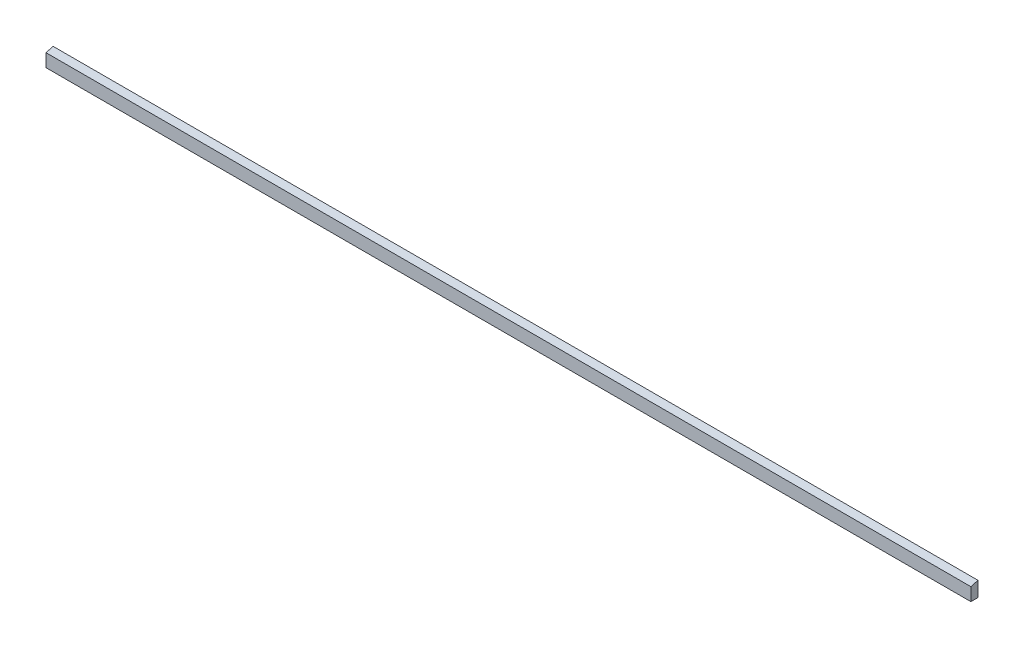
ISO-10303-21;
HEADER;
FILE_DESCRIPTION(('STEP AP214'),'2;1');
FILE_NAME('part.step','',(''),(''),'','','');
FILE_SCHEMA(('AUTOMOTIVE_DESIGN { 1 0 10303 214 1 1 1 1 }'));
ENDSEC;
DATA;
#1=APPLICATION_CONTEXT('core data for automotive mechanical design processes');
#2=APPLICATION_PROTOCOL_DEFINITION('international standard','automotive_design',2000,#1);
#3=PRODUCT_CONTEXT('',#1,'mechanical');
#4=PRODUCT('Part','Part','',(#3));
#5=PRODUCT_RELATED_PRODUCT_CATEGORY('part','',(#4));
#6=PRODUCT_DEFINITION_FORMATION('','',#4);
#7=PRODUCT_DEFINITION_CONTEXT('part definition',#1,'design');
#8=PRODUCT_DEFINITION('design','',#6,#7);
#9=PRODUCT_DEFINITION_SHAPE('','',#8);
#10=(LENGTH_UNIT() NAMED_UNIT(*) SI_UNIT(.MILLI.,.METRE.));
#11=(NAMED_UNIT(*) PLANE_ANGLE_UNIT() SI_UNIT($,.RADIAN.));
#12=(NAMED_UNIT(*) SI_UNIT($,.STERADIAN.) SOLID_ANGLE_UNIT());
#13=UNCERTAINTY_MEASURE_WITH_UNIT(LENGTH_MEASURE(1.E-05),#10,'distance_accuracy_value','');
#14=(GEOMETRIC_REPRESENTATION_CONTEXT(3) GLOBAL_UNCERTAINTY_ASSIGNED_CONTEXT((#13)) GLOBAL_UNIT_ASSIGNED_CONTEXT((#10,
#11,#12)) REPRESENTATION_CONTEXT('',''));
#15=CARTESIAN_POINT('',(0.,0.,0.));
#16=DIRECTION('',(0.,0.,1.));
#17=DIRECTION('',(1.,0.,0.));
#18=AXIS2_PLACEMENT_3D('',#15,#16,#17);
#19=CARTESIAN_POINT('',(2362.2,38.1,0.));
#20=DIRECTION('',(0.,0.,1.));
#21=DIRECTION('',(0.,-1.,0.));
#22=AXIS2_PLACEMENT_3D('',#19,#20,#21);
#23=PLANE('',#22);
#24=DIRECTION('',(0.,1.,0.));
#25=VECTOR('',#24,1.);
#26=CARTESIAN_POINT('',(0.,38.1,0.));
#27=LINE('',#26,#25);
#28=CARTESIAN_POINT('',(0.,0.,0.));
#29=VERTEX_POINT('',#28);
#30=CARTESIAN_POINT('',(0.,38.1,0.));
#31=VERTEX_POINT('',#30);
#32=EDGE_CURVE('E96',#29,#31,#27,.T.);
#33=ORIENTED_EDGE('',*,*,#32,.T.);
#34=DIRECTION('',(-1.,0.,0.));
#35=VECTOR('',#34,1.);
#36=CARTESIAN_POINT('',(2362.2,38.1,0.));
#37=LINE('',#36,#35);
#38=CARTESIAN_POINT('',(2362.2,38.1,0.));
#39=VERTEX_POINT('',#38);
#40=EDGE_CURVE('E11',#39,#31,#37,.T.);
#41=ORIENTED_EDGE('',*,*,#40,.F.);
#42=DIRECTION('',(0.,1.,0.));
#43=VECTOR('',#42,1.);
#44=CARTESIAN_POINT('',(2362.2,38.1,0.));
#45=LINE('',#44,#43);
#46=CARTESIAN_POINT('',(2362.2,0.,0.));
#47=VERTEX_POINT('',#46);
#48=EDGE_CURVE('E84',#47,#39,#45,.T.);
#49=ORIENTED_EDGE('',*,*,#48,.F.);
#50=DIRECTION('',(-1.,0.,0.));
#51=VECTOR('',#50,1.);
#52=CARTESIAN_POINT('',(2362.2,0.,0.));
#53=LINE('',#52,#51);
#54=EDGE_CURVE('E92',#47,#29,#53,.T.);
#55=ORIENTED_EDGE('',*,*,#54,.T.);
#56=EDGE_LOOP('',(#33,#41,#49,#55));
#57=FACE_BOUND('',#56,.T.);
#58=ADVANCED_FACE('F33',(#57),#23,.F.);
#59=CARTESIAN_POINT('',(2362.2,33.2082525556792,18.25625));
#60=DIRECTION('',(0.,-0.965925826289067,-0.258819045102525));
#61=DIRECTION('',(0.,0.258819045102525,-0.965925826289067));
#62=AXIS2_PLACEMENT_3D('',#59,#60,#61);
#63=PLANE('',#62);
#64=DIRECTION('',(0.,-0.258819045102525,0.965925826289067));
#65=VECTOR('',#64,1.);
#66=CARTESIAN_POINT('',(0.,33.2082525556792,18.25625));
#67=LINE('',#66,#65);
#68=CARTESIAN_POINT('',(0.,33.2082525556792,18.25625));
#69=VERTEX_POINT('',#68);
#70=EDGE_CURVE('E88',#31,#69,#67,.T.);
#71=ORIENTED_EDGE('',*,*,#70,.T.);
#72=DIRECTION('',(-1.,0.,0.));
#73=VECTOR('',#72,1.);
#74=CARTESIAN_POINT('',(2362.2,33.2082525556792,18.25625));
#75=LINE('',#74,#73);
#76=CARTESIAN_POINT('',(2362.2,33.2082525556792,18.25625));
#77=VERTEX_POINT('',#76);
#78=EDGE_CURVE('E41',#77,#69,#75,.T.);
#79=ORIENTED_EDGE('',*,*,#78,.F.);
#80=DIRECTION('',(0.,-0.258819045102525,0.965925826289067));
#81=VECTOR('',#80,1.);
#82=CARTESIAN_POINT('',(2362.2,33.2082525556792,18.25625));
#83=LINE('',#82,#81);
#84=EDGE_CURVE('E79',#39,#77,#83,.T.);
#85=ORIENTED_EDGE('',*,*,#84,.F.);
#86=ORIENTED_EDGE('',*,*,#40,.T.);
#87=EDGE_LOOP('',(#71,#79,#85,#86));
#88=FACE_BOUND('',#87,.T.);
#89=ADVANCED_FACE('F87',(#88),#63,.F.);
#90=CARTESIAN_POINT('',(2362.2,0.,18.25625));
#91=DIRECTION('',(0.,0.,-1.));
#92=DIRECTION('',(-1.,0.,0.));
#93=AXIS2_PLACEMENT_3D('',#90,#91,#92);
#94=PLANE('',#93);
#95=DIRECTION('',(0.,-1.,0.));
#96=VECTOR('',#95,1.);
#97=CARTESIAN_POINT('',(0.,0.,18.25625));
#98=LINE('',#97,#96);
#99=CARTESIAN_POINT('',(0.,0.,18.25625));
#100=VERTEX_POINT('',#99);
#101=EDGE_CURVE('E66',#69,#100,#98,.T.);
#102=ORIENTED_EDGE('',*,*,#101,.T.);
#103=DIRECTION('',(-1.,0.,0.));
#104=VECTOR('',#103,1.);
#105=CARTESIAN_POINT('',(2362.2,0.,18.25625));
#106=LINE('',#105,#104);
#107=CARTESIAN_POINT('',(2362.2,0.,18.25625));
#108=VERTEX_POINT('',#107);
#109=EDGE_CURVE('E89',#108,#100,#106,.T.);
#110=ORIENTED_EDGE('',*,*,#109,.F.);
#111=DIRECTION('',(0.,-1.,0.));
#112=VECTOR('',#111,1.);
#113=CARTESIAN_POINT('',(2362.2,0.,18.25625));
#114=LINE('',#113,#112);
#115=EDGE_CURVE('E82',#77,#108,#114,.T.);
#116=ORIENTED_EDGE('',*,*,#115,.F.);
#117=ORIENTED_EDGE('',*,*,#78,.T.);
#118=EDGE_LOOP('',(#102,#110,#116,#117));
#119=FACE_BOUND('',#118,.T.);
#120=ADVANCED_FACE('F90',(#119),#94,.F.);
#121=CARTESIAN_POINT('',(2362.2,0.,0.));
#122=DIRECTION('',(0.,1.,0.));
#123=DIRECTION('',(0.,0.,1.));
#124=AXIS2_PLACEMENT_3D('',#121,#122,#123);
#125=PLANE('',#124);
#126=DIRECTION('',(0.,0.,-1.));
#127=VECTOR('',#126,1.);
#128=CARTESIAN_POINT('',(0.,0.,0.));
#129=LINE('',#128,#127);
#130=EDGE_CURVE('E72',#100,#29,#129,.T.);
#131=ORIENTED_EDGE('',*,*,#130,.T.);
#132=ORIENTED_EDGE('',*,*,#54,.F.);
#133=DIRECTION('',(0.,0.,-1.));
#134=VECTOR('',#133,1.);
#135=CARTESIAN_POINT('',(2362.2,0.,0.));
#136=LINE('',#135,#134);
#137=EDGE_CURVE('E49',#108,#47,#136,.T.);
#138=ORIENTED_EDGE('',*,*,#137,.F.);
#139=ORIENTED_EDGE('',*,*,#109,.T.);
#140=EDGE_LOOP('',(#131,#132,#138,#139));
#141=FACE_BOUND('',#140,.T.);
#142=ADVANCED_FACE('F103',(#141),#125,.F.);
#143=CARTESIAN_POINT('',(2362.2,0.,0.));
#144=DIRECTION('',(-1.,0.,0.));
#145=DIRECTION('',(0.,0.,1.));
#146=AXIS2_PLACEMENT_3D('',#143,#144,#145);
#147=PLANE('',#146);
#148=ORIENTED_EDGE('',*,*,#48,.T.);
#149=ORIENTED_EDGE('',*,*,#84,.T.);
#150=ORIENTED_EDGE('',*,*,#115,.T.);
#151=ORIENTED_EDGE('',*,*,#137,.T.);
#152=EDGE_LOOP('',(#148,#149,#150,#151));
#153=FACE_BOUND('',#152,.T.);
#154=ADVANCED_FACE('F80',(#153),#147,.F.);
#155=CARTESIAN_POINT('',(0.,0.,0.));
#156=DIRECTION('',(-1.,0.,0.));
#157=DIRECTION('',(0.,0.,1.));
#158=AXIS2_PLACEMENT_3D('',#155,#156,#157);
#159=PLANE('',#158);
#160=ORIENTED_EDGE('',*,*,#32,.F.);
#161=ORIENTED_EDGE('',*,*,#130,.F.);
#162=ORIENTED_EDGE('',*,*,#101,.F.);
#163=ORIENTED_EDGE('',*,*,#70,.F.);
#164=EDGE_LOOP('',(#160,#161,#162,#163));
#165=FACE_BOUND('',#164,.T.);
#166=ADVANCED_FACE('F106',(#165),#159,.T.);
#167=CLOSED_SHELL('',(#58,#89,#120,#142,#154,#166));
#168=MANIFOLD_SOLID_BREP('B2',#167);
#169=ADVANCED_BREP_SHAPE_REPRESENTATION('',(#18,#168),#14);
#170=SHAPE_DEFINITION_REPRESENTATION(#9,#169);
ENDSEC;
END-ISO-10303-21;
